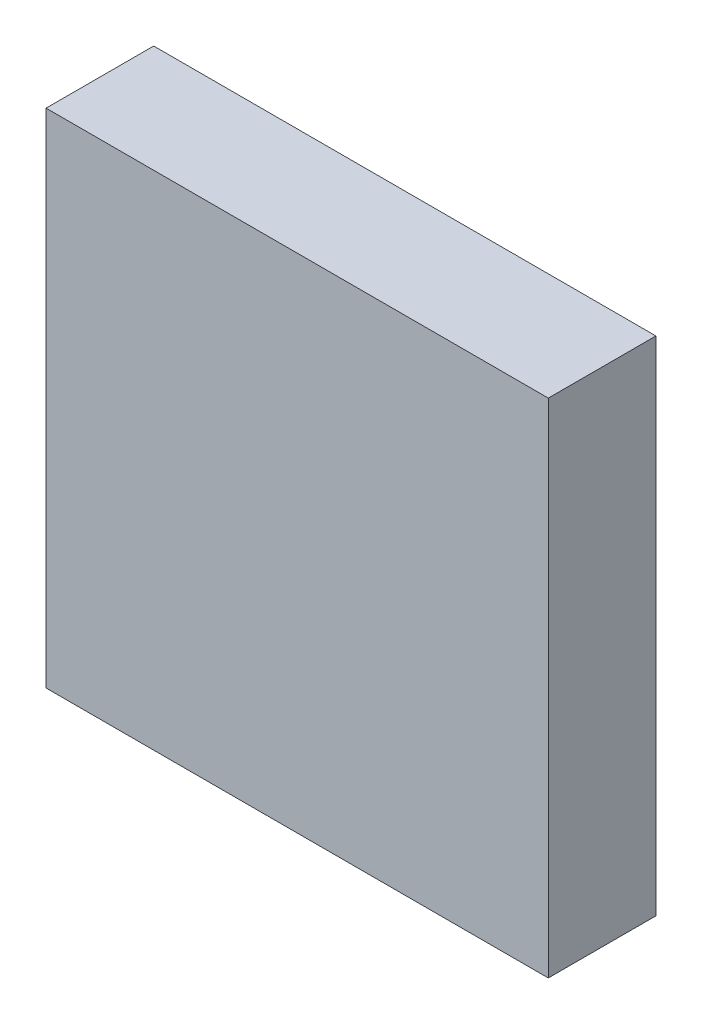
ISO-10303-21;
HEADER;
FILE_DESCRIPTION(('STEP AP214'),'2;1');
FILE_NAME('part.step','',(''),(''),'','','');
FILE_SCHEMA(('AUTOMOTIVE_DESIGN { 1 0 10303 214 1 1 1 1 }'));
ENDSEC;
DATA;
#1=APPLICATION_CONTEXT('core data for automotive mechanical design processes');
#2=APPLICATION_PROTOCOL_DEFINITION('international standard','automotive_design',2000,#1);
#3=PRODUCT_CONTEXT('',#1,'mechanical');
#4=PRODUCT('Part','Part','',(#3));
#5=PRODUCT_RELATED_PRODUCT_CATEGORY('part','',(#4));
#6=PRODUCT_DEFINITION_FORMATION('','',#4);
#7=PRODUCT_DEFINITION_CONTEXT('part definition',#1,'design');
#8=PRODUCT_DEFINITION('design','',#6,#7);
#9=PRODUCT_DEFINITION_SHAPE('','',#8);
#10=(LENGTH_UNIT() NAMED_UNIT(*) SI_UNIT(.MILLI.,.METRE.));
#11=(NAMED_UNIT(*) PLANE_ANGLE_UNIT() SI_UNIT($,.RADIAN.));
#12=(NAMED_UNIT(*) SI_UNIT($,.STERADIAN.) SOLID_ANGLE_UNIT());
#13=UNCERTAINTY_MEASURE_WITH_UNIT(LENGTH_MEASURE(1.E-05),#10,'distance_accuracy_value','');
#14=(GEOMETRIC_REPRESENTATION_CONTEXT(3) GLOBAL_UNCERTAINTY_ASSIGNED_CONTEXT((#13)) GLOBAL_UNIT_ASSIGNED_CONTEXT((#10,
#11,#12)) REPRESENTATION_CONTEXT('',''));
#15=CARTESIAN_POINT('',(0.,0.,0.));
#16=DIRECTION('',(0.,0.,1.));
#17=DIRECTION('',(1.,0.,0.));
#18=AXIS2_PLACEMENT_3D('',#15,#16,#17);
#19=CARTESIAN_POINT('',(-3.50000062,3.50000062,1.49999954));
#20=DIRECTION('',(0.,0.,1.));
#21=DIRECTION('',(1.,0.,0.));
#22=AXIS2_PLACEMENT_3D('',#19,#20,#21);
#23=PLANE('',#22);
#24=DIRECTION('',(0.,1.,0.));
#25=VECTOR('',#24,1.);
#26=CARTESIAN_POINT('',(3.50000062,3.50000062,1.49999954));
#27=LINE('',#26,#25);
#28=CARTESIAN_POINT('',(3.50000062,3.50000062,1.49999954));
#29=VERTEX_POINT('',#28);
#30=CARTESIAN_POINT('',(3.50000062,-3.50000062,1.49999954));
#31=VERTEX_POINT('',#30);
#32=EDGE_CURVE('E53',#29,#31,#27,.F.);
#33=ORIENTED_EDGE('',*,*,#32,.F.);
#34=DIRECTION('',(1.,0.,0.));
#35=VECTOR('',#34,1.);
#36=CARTESIAN_POINT('',(-3.50000062,3.50000062,1.49999954));
#37=LINE('',#36,#35);
#38=CARTESIAN_POINT('',(-3.50000062,3.50000062,1.49999954));
#39=VERTEX_POINT('',#38);
#40=EDGE_CURVE('E68',#39,#29,#37,.T.);
#41=ORIENTED_EDGE('',*,*,#40,.F.);
#42=DIRECTION('',(0.,1.,0.));
#43=VECTOR('',#42,1.);
#44=CARTESIAN_POINT('',(-3.50000062,-3.50000062,1.49999954));
#45=LINE('',#44,#43);
#46=CARTESIAN_POINT('',(-3.50000062,-3.50000062,1.49999954));
#47=VERTEX_POINT('',#46);
#48=EDGE_CURVE('E20',#47,#39,#45,.T.);
#49=ORIENTED_EDGE('',*,*,#48,.F.);
#50=DIRECTION('',(1.,0.,0.));
#51=VECTOR('',#50,1.);
#52=CARTESIAN_POINT('',(3.50000062,-3.50000062,1.49999954));
#53=LINE('',#52,#51);
#54=EDGE_CURVE('E58',#31,#47,#53,.F.);
#55=ORIENTED_EDGE('',*,*,#54,.F.);
#56=EDGE_LOOP('',(#33,#41,#49,#55));
#57=FACE_BOUND('',#56,.T.);
#58=ADVANCED_FACE('F17',(#57),#23,.T.);
#59=CARTESIAN_POINT('',(-3.50000062,-3.50000062,0.));
#60=DIRECTION('',(-1.,0.,0.));
#61=DIRECTION('',(0.,0.,1.));
#62=AXIS2_PLACEMENT_3D('',#59,#60,#61);
#63=PLANE('',#62);
#64=DIRECTION('',(0.,0.,1.));
#65=VECTOR('',#64,1.);
#66=CARTESIAN_POINT('',(-3.50000062,3.50000062,0.));
#67=LINE('',#66,#65);
#68=CARTESIAN_POINT('',(-3.50000062,3.50000062,0.));
#69=VERTEX_POINT('',#68);
#70=EDGE_CURVE('E79',#69,#39,#67,.T.);
#71=ORIENTED_EDGE('',*,*,#70,.F.);
#72=DIRECTION('',(0.,1.,0.));
#73=VECTOR('',#72,1.);
#74=CARTESIAN_POINT('',(-3.50000062,3.50000062,0.));
#75=LINE('',#74,#73);
#76=CARTESIAN_POINT('',(-3.50000062,-3.50000062,0.));
#77=VERTEX_POINT('',#76);
#78=EDGE_CURVE('E74',#69,#77,#75,.F.);
#79=ORIENTED_EDGE('',*,*,#78,.T.);
#80=DIRECTION('',(0.,0.,-1.));
#81=VECTOR('',#80,1.);
#82=CARTESIAN_POINT('',(-3.50000062,-3.50000062,0.));
#83=LINE('',#82,#81);
#84=EDGE_CURVE('E63',#47,#77,#83,.T.);
#85=ORIENTED_EDGE('',*,*,#84,.F.);
#86=ORIENTED_EDGE('',*,*,#48,.T.);
#87=EDGE_LOOP('',(#71,#79,#85,#86));
#88=FACE_BOUND('',#87,.T.);
#89=ADVANCED_FACE('F73',(#88),#63,.T.);
#90=CARTESIAN_POINT('',(3.50000062,-3.50000062,0.));
#91=DIRECTION('',(0.,-1.,0.));
#92=DIRECTION('',(0.,0.,-1.));
#93=AXIS2_PLACEMENT_3D('',#90,#91,#92);
#94=PLANE('',#93);
#95=ORIENTED_EDGE('',*,*,#84,.T.);
#96=DIRECTION('',(1.,0.,0.));
#97=VECTOR('',#96,1.);
#98=CARTESIAN_POINT('',(-3.50000062,-3.50000062,0.));
#99=LINE('',#98,#97);
#100=CARTESIAN_POINT('',(3.50000062,-3.50000062,0.));
#101=VERTEX_POINT('',#100);
#102=EDGE_CURVE('E84',#77,#101,#99,.T.);
#103=ORIENTED_EDGE('',*,*,#102,.T.);
#104=DIRECTION('',(0.,0.,-1.));
#105=VECTOR('',#104,1.);
#106=CARTESIAN_POINT('',(3.50000062,-3.50000062,0.));
#107=LINE('',#106,#105);
#108=EDGE_CURVE('E65',#31,#101,#107,.T.);
#109=ORIENTED_EDGE('',*,*,#108,.F.);
#110=ORIENTED_EDGE('',*,*,#54,.T.);
#111=EDGE_LOOP('',(#95,#103,#109,#110));
#112=FACE_BOUND('',#111,.T.);
#113=ADVANCED_FACE('F60',(#112),#94,.T.);
#114=CARTESIAN_POINT('',(3.50000062,3.50000062,0.));
#115=DIRECTION('',(1.,0.,0.));
#116=DIRECTION('',(0.,0.,-1.));
#117=AXIS2_PLACEMENT_3D('',#114,#115,#116);
#118=PLANE('',#117);
#119=ORIENTED_EDGE('',*,*,#108,.T.);
#120=DIRECTION('',(0.,1.,0.));
#121=VECTOR('',#120,1.);
#122=CARTESIAN_POINT('',(3.50000062,3.50000062,0.));
#123=LINE('',#122,#121);
#124=CARTESIAN_POINT('',(3.50000062,3.50000062,0.));
#125=VERTEX_POINT('',#124);
#126=EDGE_CURVE('E26',#101,#125,#123,.T.);
#127=ORIENTED_EDGE('',*,*,#126,.T.);
#128=DIRECTION('',(0.,0.,1.));
#129=VECTOR('',#128,1.);
#130=CARTESIAN_POINT('',(3.50000062,3.50000062,0.));
#131=LINE('',#130,#129);
#132=EDGE_CURVE('E34',#29,#125,#131,.F.);
#133=ORIENTED_EDGE('',*,*,#132,.F.);
#134=ORIENTED_EDGE('',*,*,#32,.T.);
#135=EDGE_LOOP('',(#119,#127,#133,#134));
#136=FACE_BOUND('',#135,.T.);
#137=ADVANCED_FACE('F88',(#136),#118,.T.);
#138=CARTESIAN_POINT('',(-3.50000062,3.50000062,0.));
#139=DIRECTION('',(0.,1.,0.));
#140=DIRECTION('',(0.,0.,1.));
#141=AXIS2_PLACEMENT_3D('',#138,#139,#140);
#142=PLANE('',#141);
#143=ORIENTED_EDGE('',*,*,#132,.T.);
#144=DIRECTION('',(1.,0.,0.));
#145=VECTOR('',#144,1.);
#146=CARTESIAN_POINT('',(-3.50000062,3.50000062,0.));
#147=LINE('',#146,#145);
#148=EDGE_CURVE('E11',#125,#69,#147,.F.);
#149=ORIENTED_EDGE('',*,*,#148,.T.);
#150=ORIENTED_EDGE('',*,*,#70,.T.);
#151=ORIENTED_EDGE('',*,*,#40,.T.);
#152=EDGE_LOOP('',(#143,#149,#150,#151));
#153=FACE_BOUND('',#152,.T.);
#154=ADVANCED_FACE('F91',(#153),#142,.T.);
#155=CARTESIAN_POINT('',(-3.50000062,3.50000062,0.));
#156=DIRECTION('',(0.,0.,1.));
#157=DIRECTION('',(1.,0.,0.));
#158=AXIS2_PLACEMENT_3D('',#155,#156,#157);
#159=PLANE('',#158);
#160=ORIENTED_EDGE('',*,*,#126,.F.);
#161=ORIENTED_EDGE('',*,*,#102,.F.);
#162=ORIENTED_EDGE('',*,*,#78,.F.);
#163=ORIENTED_EDGE('',*,*,#148,.F.);
#164=EDGE_LOOP('',(#160,#161,#162,#163));
#165=FACE_BOUND('',#164,.T.);
#166=ADVANCED_FACE('F90',(#165),#159,.F.);
#167=CLOSED_SHELL('',(#58,#89,#113,#137,#154,#166));
#168=MANIFOLD_SOLID_BREP('B1',#167);
#169=ADVANCED_BREP_SHAPE_REPRESENTATION('',(#18,#168),#14);
#170=SHAPE_DEFINITION_REPRESENTATION(#9,#169);
ENDSEC;
END-ISO-10303-21;
